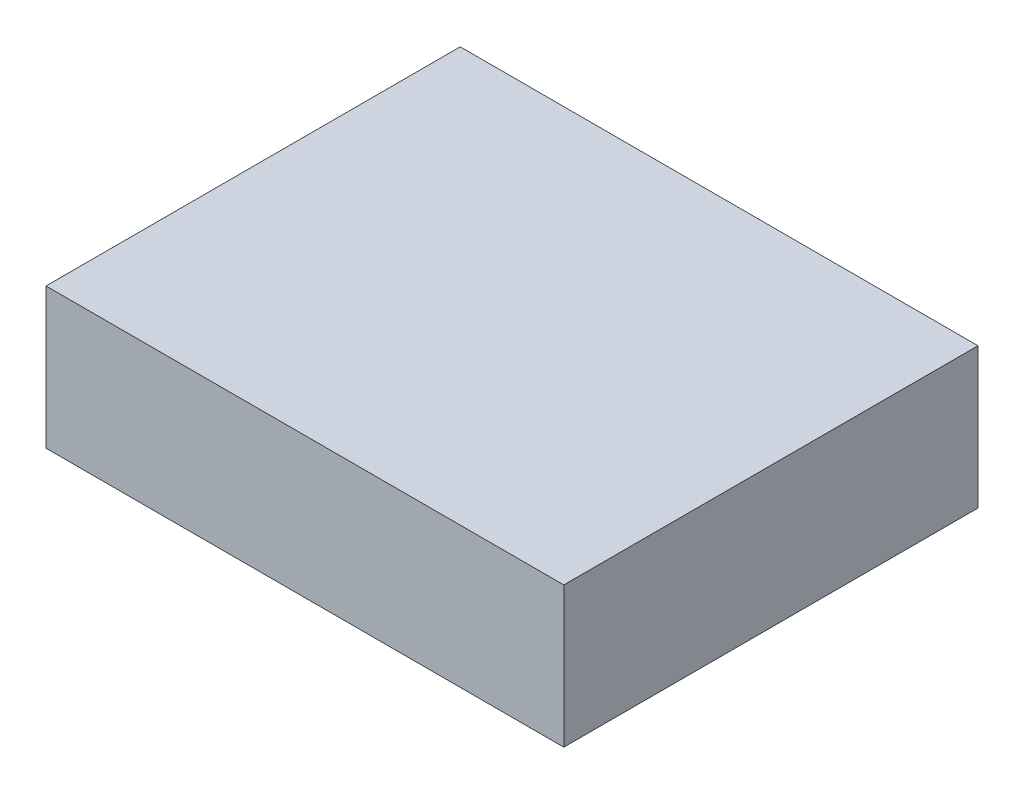
ISO-10303-21;
HEADER;
FILE_DESCRIPTION(('STEP AP214'),'2;1');
FILE_NAME('part.step','',(''),(''),'','','');
FILE_SCHEMA(('AUTOMOTIVE_DESIGN { 1 0 10303 214 1 1 1 1 }'));
ENDSEC;
DATA;
#1=APPLICATION_CONTEXT('core data for automotive mechanical design processes');
#2=APPLICATION_PROTOCOL_DEFINITION('international standard','automotive_design',2000,#1);
#3=PRODUCT_CONTEXT('',#1,'mechanical');
#4=PRODUCT('Part','Part','',(#3));
#5=PRODUCT_RELATED_PRODUCT_CATEGORY('part','',(#4));
#6=PRODUCT_DEFINITION_FORMATION('','',#4);
#7=PRODUCT_DEFINITION_CONTEXT('part definition',#1,'design');
#8=PRODUCT_DEFINITION('design','',#6,#7);
#9=PRODUCT_DEFINITION_SHAPE('','',#8);
#10=(LENGTH_UNIT() NAMED_UNIT(*) SI_UNIT(.MILLI.,.METRE.));
#11=(NAMED_UNIT(*) PLANE_ANGLE_UNIT() SI_UNIT($,.RADIAN.));
#12=(NAMED_UNIT(*) SI_UNIT($,.STERADIAN.) SOLID_ANGLE_UNIT());
#13=UNCERTAINTY_MEASURE_WITH_UNIT(LENGTH_MEASURE(1.E-05),#10,'distance_accuracy_value','');
#14=(GEOMETRIC_REPRESENTATION_CONTEXT(3) GLOBAL_UNCERTAINTY_ASSIGNED_CONTEXT((#13)) GLOBAL_UNIT_ASSIGNED_CONTEXT((#10,
#11,#12)) REPRESENTATION_CONTEXT('',''));
#15=CARTESIAN_POINT('',(0.,0.,0.));
#16=DIRECTION('',(0.,0.,1.));
#17=DIRECTION('',(1.,0.,0.));
#18=AXIS2_PLACEMENT_3D('',#15,#16,#17);
#19=CARTESIAN_POINT('',(0.,19.,0.));
#20=DIRECTION('',(1.,0.,0.));
#21=DIRECTION('',(0.,0.,-1.));
#22=AXIS2_PLACEMENT_3D('',#19,#20,#21);
#23=PLANE('',#22);
#24=DIRECTION('',(0.,0.,1.));
#25=VECTOR('',#24,1.);
#26=CARTESIAN_POINT('',(0.,0.,0.));
#27=LINE('',#26,#25);
#28=CARTESIAN_POINT('',(0.,0.,-56.));
#29=VERTEX_POINT('',#28);
#30=CARTESIAN_POINT('',(0.,0.,0.));
#31=VERTEX_POINT('',#30);
#32=EDGE_CURVE('E98',#29,#31,#27,.T.);
#33=ORIENTED_EDGE('',*,*,#32,.T.);
#34=DIRECTION('',(0.,-1.,0.));
#35=VECTOR('',#34,1.);
#36=CARTESIAN_POINT('',(0.,19.,0.));
#37=LINE('',#36,#35);
#38=CARTESIAN_POINT('',(0.,19.,0.));
#39=VERTEX_POINT('',#38);
#40=EDGE_CURVE('E11',#39,#31,#37,.T.);
#41=ORIENTED_EDGE('',*,*,#40,.F.);
#42=DIRECTION('',(0.,0.,1.));
#43=VECTOR('',#42,1.);
#44=CARTESIAN_POINT('',(0.,19.,0.));
#45=LINE('',#44,#43);
#46=CARTESIAN_POINT('',(0.,19.,-56.));
#47=VERTEX_POINT('',#46);
#48=EDGE_CURVE('E86',#47,#39,#45,.T.);
#49=ORIENTED_EDGE('',*,*,#48,.F.);
#50=DIRECTION('',(0.,-1.,0.));
#51=VECTOR('',#50,1.);
#52=CARTESIAN_POINT('',(0.,19.,-56.));
#53=LINE('',#52,#51);
#54=EDGE_CURVE('E94',#47,#29,#53,.T.);
#55=ORIENTED_EDGE('',*,*,#54,.T.);
#56=EDGE_LOOP('',(#33,#41,#49,#55));
#57=FACE_BOUND('',#56,.T.);
#58=ADVANCED_FACE('F35',(#57),#23,.F.);
#59=CARTESIAN_POINT('',(0.,19.,0.));
#60=DIRECTION('',(0.,0.,-1.));
#61=DIRECTION('',(-1.,0.,0.));
#62=AXIS2_PLACEMENT_3D('',#59,#60,#61);
#63=PLANE('',#62);
#64=DIRECTION('',(1.,0.,0.));
#65=VECTOR('',#64,1.);
#66=CARTESIAN_POINT('',(0.,0.,0.));
#67=LINE('',#66,#65);
#68=CARTESIAN_POINT('',(70.,0.,0.));
#69=VERTEX_POINT('',#68);
#70=EDGE_CURVE('E90',#31,#69,#67,.T.);
#71=ORIENTED_EDGE('',*,*,#70,.T.);
#72=DIRECTION('',(0.,-1.,0.));
#73=VECTOR('',#72,1.);
#74=CARTESIAN_POINT('',(70.,19.,0.));
#75=LINE('',#74,#73);
#76=CARTESIAN_POINT('',(70.,19.,0.));
#77=VERTEX_POINT('',#76);
#78=EDGE_CURVE('E43',#77,#69,#75,.T.);
#79=ORIENTED_EDGE('',*,*,#78,.F.);
#80=DIRECTION('',(1.,0.,0.));
#81=VECTOR('',#80,1.);
#82=CARTESIAN_POINT('',(0.,19.,0.));
#83=LINE('',#82,#81);
#84=EDGE_CURVE('E81',#39,#77,#83,.T.);
#85=ORIENTED_EDGE('',*,*,#84,.F.);
#86=ORIENTED_EDGE('',*,*,#40,.T.);
#87=EDGE_LOOP('',(#71,#79,#85,#86));
#88=FACE_BOUND('',#87,.T.);
#89=ADVANCED_FACE('F89',(#88),#63,.F.);
#90=CARTESIAN_POINT('',(70.,19.,0.));
#91=DIRECTION('',(-1.,0.,0.));
#92=DIRECTION('',(0.,0.,1.));
#93=AXIS2_PLACEMENT_3D('',#90,#91,#92);
#94=PLANE('',#93);
#95=DIRECTION('',(0.,0.,-1.));
#96=VECTOR('',#95,1.);
#97=CARTESIAN_POINT('',(70.,0.,0.));
#98=LINE('',#97,#96);
#99=CARTESIAN_POINT('',(70.,0.,-56.));
#100=VERTEX_POINT('',#99);
#101=EDGE_CURVE('E68',#69,#100,#98,.T.);
#102=ORIENTED_EDGE('',*,*,#101,.T.);
#103=DIRECTION('',(0.,-1.,0.));
#104=VECTOR('',#103,1.);
#105=CARTESIAN_POINT('',(70.,19.,-56.));
#106=LINE('',#105,#104);
#107=CARTESIAN_POINT('',(70.,19.,-56.));
#108=VERTEX_POINT('',#107);
#109=EDGE_CURVE('E91',#108,#100,#106,.T.);
#110=ORIENTED_EDGE('',*,*,#109,.F.);
#111=DIRECTION('',(0.,0.,-1.));
#112=VECTOR('',#111,1.);
#113=CARTESIAN_POINT('',(70.,19.,0.));
#114=LINE('',#113,#112);
#115=EDGE_CURVE('E84',#77,#108,#114,.T.);
#116=ORIENTED_EDGE('',*,*,#115,.F.);
#117=ORIENTED_EDGE('',*,*,#78,.T.);
#118=EDGE_LOOP('',(#102,#110,#116,#117));
#119=FACE_BOUND('',#118,.T.);
#120=ADVANCED_FACE('F92',(#119),#94,.F.);
#121=CARTESIAN_POINT('',(0.,19.,-56.));
#122=DIRECTION('',(0.,0.,1.));
#123=DIRECTION('',(1.,0.,0.));
#124=AXIS2_PLACEMENT_3D('',#121,#122,#123);
#125=PLANE('',#124);
#126=DIRECTION('',(-1.,0.,0.));
#127=VECTOR('',#126,1.);
#128=CARTESIAN_POINT('',(0.,0.,-56.));
#129=LINE('',#128,#127);
#130=EDGE_CURVE('E74',#100,#29,#129,.T.);
#131=ORIENTED_EDGE('',*,*,#130,.T.);
#132=ORIENTED_EDGE('',*,*,#54,.F.);
#133=DIRECTION('',(-1.,0.,0.));
#134=VECTOR('',#133,1.);
#135=CARTESIAN_POINT('',(0.,19.,-56.));
#136=LINE('',#135,#134);
#137=EDGE_CURVE('E51',#108,#47,#136,.T.);
#138=ORIENTED_EDGE('',*,*,#137,.F.);
#139=ORIENTED_EDGE('',*,*,#109,.T.);
#140=EDGE_LOOP('',(#131,#132,#138,#139));
#141=FACE_BOUND('',#140,.T.);
#142=ADVANCED_FACE('F105',(#141),#125,.F.);
#143=CARTESIAN_POINT('',(0.,19.,0.));
#144=DIRECTION('',(0.,-1.,0.));
#145=DIRECTION('',(0.,0.,-1.));
#146=AXIS2_PLACEMENT_3D('',#143,#144,#145);
#147=PLANE('',#146);
#148=ORIENTED_EDGE('',*,*,#48,.T.);
#149=ORIENTED_EDGE('',*,*,#84,.T.);
#150=ORIENTED_EDGE('',*,*,#115,.T.);
#151=ORIENTED_EDGE('',*,*,#137,.T.);
#152=EDGE_LOOP('',(#148,#149,#150,#151));
#153=FACE_BOUND('',#152,.T.);
#154=ADVANCED_FACE('F82',(#153),#147,.F.);
#155=CARTESIAN_POINT('',(0.,0.,0.));
#156=DIRECTION('',(0.,-1.,0.));
#157=DIRECTION('',(0.,0.,-1.));
#158=AXIS2_PLACEMENT_3D('',#155,#156,#157);
#159=PLANE('',#158);
#160=ORIENTED_EDGE('',*,*,#32,.F.);
#161=ORIENTED_EDGE('',*,*,#130,.F.);
#162=ORIENTED_EDGE('',*,*,#101,.F.);
#163=ORIENTED_EDGE('',*,*,#70,.F.);
#164=EDGE_LOOP('',(#160,#161,#162,#163));
#165=FACE_BOUND('',#164,.T.);
#166=ADVANCED_FACE('F108',(#165),#159,.T.);
#167=CLOSED_SHELL('',(#58,#89,#120,#142,#154,#166));
#168=MANIFOLD_SOLID_BREP('B2',#167);
#169=ADVANCED_BREP_SHAPE_REPRESENTATION('',(#18,#168),#14);
#170=SHAPE_DEFINITION_REPRESENTATION(#9,#169);
ENDSEC;
END-ISO-10303-21;
